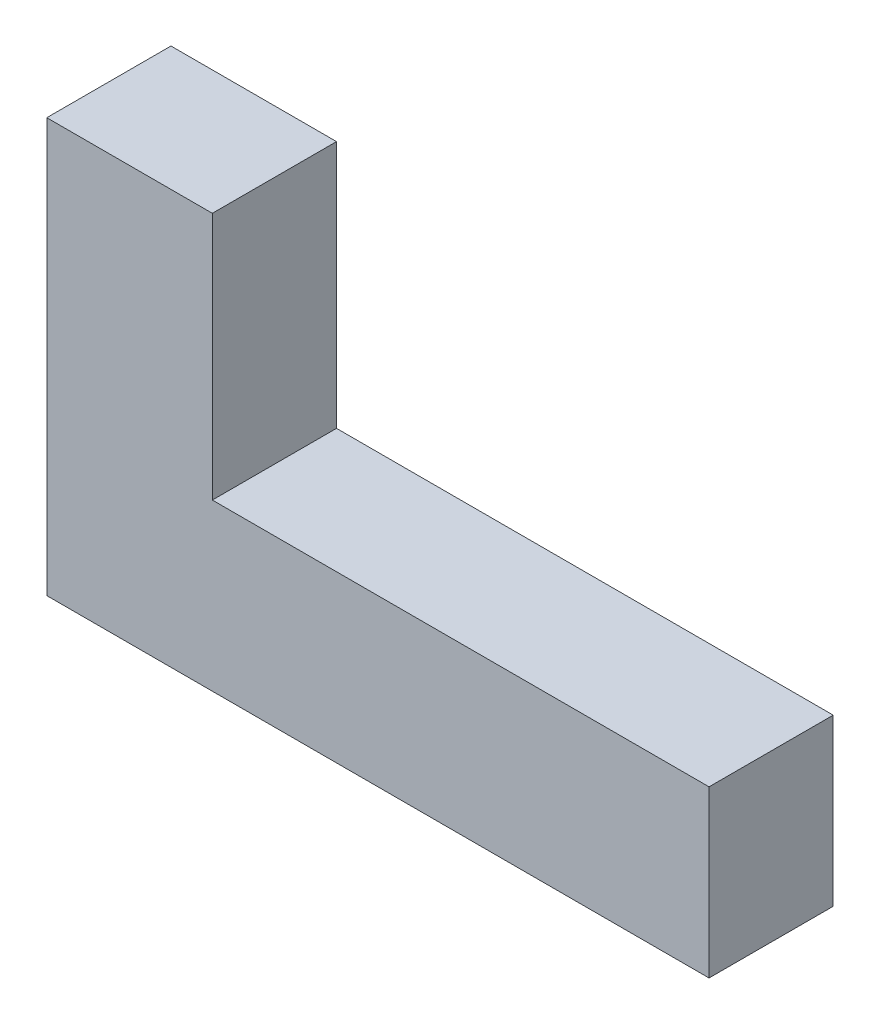
ISO-10303-21;
HEADER;
FILE_DESCRIPTION(('STEP AP214'),'2;1');
FILE_NAME('part.step','',(''),(''),'','','');
FILE_SCHEMA(('AUTOMOTIVE_DESIGN { 1 0 10303 214 1 1 1 1 }'));
ENDSEC;
DATA;
#1=APPLICATION_CONTEXT('core data for automotive mechanical design processes');
#2=APPLICATION_PROTOCOL_DEFINITION('international standard','automotive_design',2000,#1);
#3=PRODUCT_CONTEXT('',#1,'mechanical');
#4=PRODUCT('Part','Part','',(#3));
#5=PRODUCT_RELATED_PRODUCT_CATEGORY('part','',(#4));
#6=PRODUCT_DEFINITION_FORMATION('','',#4);
#7=PRODUCT_DEFINITION_CONTEXT('part definition',#1,'design');
#8=PRODUCT_DEFINITION('design','',#6,#7);
#9=PRODUCT_DEFINITION_SHAPE('','',#8);
#10=(LENGTH_UNIT() NAMED_UNIT(*) SI_UNIT(.MILLI.,.METRE.));
#11=(NAMED_UNIT(*) PLANE_ANGLE_UNIT() SI_UNIT($,.RADIAN.));
#12=(NAMED_UNIT(*) SI_UNIT($,.STERADIAN.) SOLID_ANGLE_UNIT());
#13=UNCERTAINTY_MEASURE_WITH_UNIT(LENGTH_MEASURE(1.E-05),#10,'distance_accuracy_value','');
#14=(GEOMETRIC_REPRESENTATION_CONTEXT(3) GLOBAL_UNCERTAINTY_ASSIGNED_CONTEXT((#13)) GLOBAL_UNIT_ASSIGNED_CONTEXT((#10,
#11,#12)) REPRESENTATION_CONTEXT('',''));
#15=CARTESIAN_POINT('',(0.,0.,0.));
#16=DIRECTION('',(0.,0.,1.));
#17=DIRECTION('',(1.,0.,0.));
#18=AXIS2_PLACEMENT_3D('',#15,#16,#17);
#19=CARTESIAN_POINT('',(0.,0.,15.));
#20=DIRECTION('',(0.,1.,0.));
#21=DIRECTION('',(0.,0.,1.));
#22=AXIS2_PLACEMENT_3D('',#19,#20,#21);
#23=PLANE('',#22);
#24=DIRECTION('',(1.,0.,0.));
#25=VECTOR('',#24,1.);
#26=CARTESIAN_POINT('',(0.,0.,0.));
#27=LINE('',#26,#25);
#28=CARTESIAN_POINT('',(0.,0.,0.));
#29=VERTEX_POINT('',#28);
#30=CARTESIAN_POINT('',(80.,0.,0.));
#31=VERTEX_POINT('',#30);
#32=EDGE_CURVE('E127',#29,#31,#27,.T.);
#33=ORIENTED_EDGE('',*,*,#32,.T.);
#34=DIRECTION('',(0.,0.,-1.));
#35=VECTOR('',#34,1.);
#36=CARTESIAN_POINT('',(80.,0.,15.));
#37=LINE('',#36,#35);
#38=CARTESIAN_POINT('',(80.,0.,15.));
#39=VERTEX_POINT('',#38);
#40=EDGE_CURVE('E11',#39,#31,#37,.T.);
#41=ORIENTED_EDGE('',*,*,#40,.F.);
#42=DIRECTION('',(1.,0.,0.));
#43=VECTOR('',#42,1.);
#44=CARTESIAN_POINT('',(0.,0.,15.));
#45=LINE('',#44,#43);
#46=CARTESIAN_POINT('',(0.,0.,15.));
#47=VERTEX_POINT('',#46);
#48=EDGE_CURVE('E137',#47,#39,#45,.T.);
#49=ORIENTED_EDGE('',*,*,#48,.F.);
#50=DIRECTION('',(0.,0.,-1.));
#51=VECTOR('',#50,1.);
#52=CARTESIAN_POINT('',(0.,0.,15.));
#53=LINE('',#52,#51);
#54=EDGE_CURVE('E123',#47,#29,#53,.T.);
#55=ORIENTED_EDGE('',*,*,#54,.T.);
#56=EDGE_LOOP('',(#33,#41,#49,#55));
#57=FACE_BOUND('',#56,.T.);
#58=ADVANCED_FACE('F43',(#57),#23,.F.);
#59=CARTESIAN_POINT('',(80.,20.,15.));
#60=DIRECTION('',(-1.,0.,0.));
#61=DIRECTION('',(0.,0.,1.));
#62=AXIS2_PLACEMENT_3D('',#59,#60,#61);
#63=PLANE('',#62);
#64=DIRECTION('',(0.,1.,0.));
#65=VECTOR('',#64,1.);
#66=CARTESIAN_POINT('',(80.,20.,0.));
#67=LINE('',#66,#65);
#68=CARTESIAN_POINT('',(80.,20.,0.));
#69=VERTEX_POINT('',#68);
#70=EDGE_CURVE('E130',#31,#69,#67,.T.);
#71=ORIENTED_EDGE('',*,*,#70,.T.);
#72=DIRECTION('',(0.,0.,-1.));
#73=VECTOR('',#72,1.);
#74=CARTESIAN_POINT('',(80.,20.,15.));
#75=LINE('',#74,#73);
#76=CARTESIAN_POINT('',(80.,20.,15.));
#77=VERTEX_POINT('',#76);
#78=EDGE_CURVE('E51',#77,#69,#75,.T.);
#79=ORIENTED_EDGE('',*,*,#78,.F.);
#80=DIRECTION('',(0.,1.,0.));
#81=VECTOR('',#80,1.);
#82=CARTESIAN_POINT('',(80.,20.,15.));
#83=LINE('',#82,#81);
#84=EDGE_CURVE('E96',#39,#77,#83,.T.);
#85=ORIENTED_EDGE('',*,*,#84,.F.);
#86=ORIENTED_EDGE('',*,*,#40,.T.);
#87=EDGE_LOOP('',(#71,#79,#85,#86));
#88=FACE_BOUND('',#87,.T.);
#89=ADVANCED_FACE('F161',(#88),#63,.F.);
#90=CARTESIAN_POINT('',(20.,20.,15.));
#91=DIRECTION('',(0.,-1.,0.));
#92=DIRECTION('',(0.,0.,-1.));
#93=AXIS2_PLACEMENT_3D('',#90,#91,#92);
#94=PLANE('',#93);
#95=DIRECTION('',(-1.,0.,0.));
#96=VECTOR('',#95,1.);
#97=CARTESIAN_POINT('',(20.,20.,0.));
#98=LINE('',#97,#96);
#99=CARTESIAN_POINT('',(20.,20.,0.));
#100=VERTEX_POINT('',#99);
#101=EDGE_CURVE('E132',#69,#100,#98,.T.);
#102=ORIENTED_EDGE('',*,*,#101,.T.);
#103=DIRECTION('',(0.,0.,-1.));
#104=VECTOR('',#103,1.);
#105=CARTESIAN_POINT('',(20.,20.,15.));
#106=LINE('',#105,#104);
#107=CARTESIAN_POINT('',(20.,20.,15.));
#108=VERTEX_POINT('',#107);
#109=EDGE_CURVE('E118',#108,#100,#106,.T.);
#110=ORIENTED_EDGE('',*,*,#109,.F.);
#111=DIRECTION('',(-1.,0.,0.));
#112=VECTOR('',#111,1.);
#113=CARTESIAN_POINT('',(20.,20.,15.));
#114=LINE('',#113,#112);
#115=EDGE_CURVE('E109',#77,#108,#114,.T.);
#116=ORIENTED_EDGE('',*,*,#115,.F.);
#117=ORIENTED_EDGE('',*,*,#78,.T.);
#118=EDGE_LOOP('',(#102,#110,#116,#117));
#119=FACE_BOUND('',#118,.T.);
#120=ADVANCED_FACE('F143',(#119),#94,.F.);
#121=CARTESIAN_POINT('',(20.,50.,15.));
#122=DIRECTION('',(-1.,0.,0.));
#123=DIRECTION('',(0.,0.,1.));
#124=AXIS2_PLACEMENT_3D('',#121,#122,#123);
#125=PLANE('',#124);
#126=DIRECTION('',(0.,1.,0.));
#127=VECTOR('',#126,1.);
#128=CARTESIAN_POINT('',(20.,50.,0.));
#129=LINE('',#128,#127);
#130=CARTESIAN_POINT('',(20.,50.,0.));
#131=VERTEX_POINT('',#130);
#132=EDGE_CURVE('E117',#100,#131,#129,.T.);
#133=ORIENTED_EDGE('',*,*,#132,.T.);
#134=DIRECTION('',(0.,0.,-1.));
#135=VECTOR('',#134,1.);
#136=CARTESIAN_POINT('',(20.,50.,15.));
#137=LINE('',#136,#135);
#138=CARTESIAN_POINT('',(20.,50.,15.));
#139=VERTEX_POINT('',#138);
#140=EDGE_CURVE('E114',#139,#131,#137,.T.);
#141=ORIENTED_EDGE('',*,*,#140,.F.);
#142=DIRECTION('',(0.,1.,0.));
#143=VECTOR('',#142,1.);
#144=CARTESIAN_POINT('',(20.,50.,15.));
#145=LINE('',#144,#143);
#146=EDGE_CURVE('E103',#108,#139,#145,.T.);
#147=ORIENTED_EDGE('',*,*,#146,.F.);
#148=ORIENTED_EDGE('',*,*,#109,.T.);
#149=EDGE_LOOP('',(#133,#141,#147,#148));
#150=FACE_BOUND('',#149,.T.);
#151=ADVANCED_FACE('F115',(#150),#125,.F.);
#152=CARTESIAN_POINT('',(0.,50.,15.));
#153=DIRECTION('',(0.,-1.,0.));
#154=DIRECTION('',(0.,0.,-1.));
#155=AXIS2_PLACEMENT_3D('',#152,#153,#154);
#156=PLANE('',#155);
#157=DIRECTION('',(-1.,0.,0.));
#158=VECTOR('',#157,1.);
#159=CARTESIAN_POINT('',(0.,50.,0.));
#160=LINE('',#159,#158);
#161=CARTESIAN_POINT('',(0.,50.,0.));
#162=VERTEX_POINT('',#161);
#163=EDGE_CURVE('E82',#131,#162,#160,.T.);
#164=ORIENTED_EDGE('',*,*,#163,.T.);
#165=DIRECTION('',(0.,0.,-1.));
#166=VECTOR('',#165,1.);
#167=CARTESIAN_POINT('',(0.,50.,15.));
#168=LINE('',#167,#166);
#169=CARTESIAN_POINT('',(0.,50.,15.));
#170=VERTEX_POINT('',#169);
#171=EDGE_CURVE('E119',#170,#162,#168,.T.);
#172=ORIENTED_EDGE('',*,*,#171,.F.);
#173=DIRECTION('',(-1.,0.,0.));
#174=VECTOR('',#173,1.);
#175=CARTESIAN_POINT('',(0.,50.,15.));
#176=LINE('',#175,#174);
#177=EDGE_CURVE('E107',#139,#170,#176,.T.);
#178=ORIENTED_EDGE('',*,*,#177,.F.);
#179=ORIENTED_EDGE('',*,*,#140,.T.);
#180=EDGE_LOOP('',(#164,#172,#178,#179));
#181=FACE_BOUND('',#180,.T.);
#182=ADVANCED_FACE('F121',(#181),#156,.F.);
#183=CARTESIAN_POINT('',(0.,0.,15.));
#184=DIRECTION('',(1.,0.,0.));
#185=DIRECTION('',(0.,0.,-1.));
#186=AXIS2_PLACEMENT_3D('',#183,#184,#185);
#187=PLANE('',#186);
#188=DIRECTION('',(0.,-1.,0.));
#189=VECTOR('',#188,1.);
#190=CARTESIAN_POINT('',(0.,0.,0.));
#191=LINE('',#190,#189);
#192=EDGE_CURVE('E88',#162,#29,#191,.T.);
#193=ORIENTED_EDGE('',*,*,#192,.T.);
#194=ORIENTED_EDGE('',*,*,#54,.F.);
#195=DIRECTION('',(0.,-1.,0.));
#196=VECTOR('',#195,1.);
#197=CARTESIAN_POINT('',(0.,0.,15.));
#198=LINE('',#197,#196);
#199=EDGE_CURVE('E59',#170,#47,#198,.T.);
#200=ORIENTED_EDGE('',*,*,#199,.F.);
#201=ORIENTED_EDGE('',*,*,#171,.T.);
#202=EDGE_LOOP('',(#193,#194,#200,#201));
#203=FACE_BOUND('',#202,.T.);
#204=ADVANCED_FACE('F150',(#203),#187,.F.);
#205=CARTESIAN_POINT('',(0.,0.,15.));
#206=DIRECTION('',(0.,0.,-1.));
#207=DIRECTION('',(-1.,0.,0.));
#208=AXIS2_PLACEMENT_3D('',#205,#206,#207);
#209=PLANE('',#208);
#210=ORIENTED_EDGE('',*,*,#48,.T.);
#211=ORIENTED_EDGE('',*,*,#84,.T.);
#212=ORIENTED_EDGE('',*,*,#115,.T.);
#213=ORIENTED_EDGE('',*,*,#146,.T.);
#214=ORIENTED_EDGE('',*,*,#177,.T.);
#215=ORIENTED_EDGE('',*,*,#199,.T.);
#216=EDGE_LOOP('',(#210,#211,#212,#213,#214,#215));
#217=FACE_BOUND('',#216,.T.);
#218=ADVANCED_FACE('F105',(#217),#209,.F.);
#219=CARTESIAN_POINT('',(0.,0.,0.));
#220=DIRECTION('',(0.,0.,-1.));
#221=DIRECTION('',(-1.,0.,0.));
#222=AXIS2_PLACEMENT_3D('',#219,#220,#221);
#223=PLANE('',#222);
#224=ORIENTED_EDGE('',*,*,#32,.F.);
#225=ORIENTED_EDGE('',*,*,#192,.F.);
#226=ORIENTED_EDGE('',*,*,#163,.F.);
#227=ORIENTED_EDGE('',*,*,#132,.F.);
#228=ORIENTED_EDGE('',*,*,#101,.F.);
#229=ORIENTED_EDGE('',*,*,#70,.F.);
#230=EDGE_LOOP('',(#224,#225,#226,#227,#228,#229));
#231=FACE_BOUND('',#230,.T.);
#232=ADVANCED_FACE('F146',(#231),#223,.T.);
#233=CLOSED_SHELL('',(#58,#89,#120,#151,#182,#204,#218,#232));
#234=MANIFOLD_SOLID_BREP('B2',#233);
#235=ADVANCED_BREP_SHAPE_REPRESENTATION('',(#18,#234),#14);
#236=SHAPE_DEFINITION_REPRESENTATION(#9,#235);
ENDSEC;
END-ISO-10303-21;
